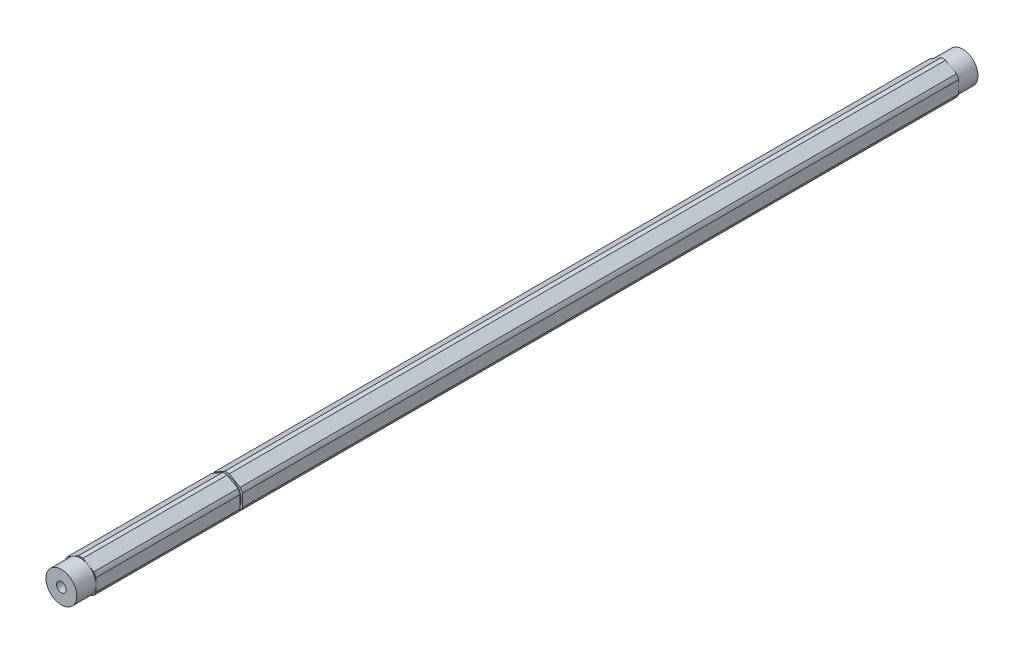
ISO-10303-21;
HEADER;
FILE_DESCRIPTION(('STEP AP214'),'2;1');
FILE_NAME('part.step','',(''),(''),'','','');
FILE_SCHEMA(('AUTOMOTIVE_DESIGN { 1 0 10303 214 1 1 1 1 }'));
ENDSEC;
DATA;
#1=APPLICATION_CONTEXT('core data for automotive mechanical design processes');
#2=APPLICATION_PROTOCOL_DEFINITION('international standard','automotive_design',2000,#1);
#3=PRODUCT_CONTEXT('',#1,'mechanical');
#4=PRODUCT('Part','Part','',(#3));
#5=PRODUCT_RELATED_PRODUCT_CATEGORY('part','',(#4));
#6=PRODUCT_DEFINITION_FORMATION('','',#4);
#7=PRODUCT_DEFINITION_CONTEXT('part definition',#1,'design');
#8=PRODUCT_DEFINITION('design','',#6,#7);
#9=PRODUCT_DEFINITION_SHAPE('','',#8);
#10=(LENGTH_UNIT() NAMED_UNIT(*) SI_UNIT(.MILLI.,.METRE.));
#11=(NAMED_UNIT(*) PLANE_ANGLE_UNIT() SI_UNIT($,.RADIAN.));
#12=(NAMED_UNIT(*) SI_UNIT($,.STERADIAN.) SOLID_ANGLE_UNIT());
#13=UNCERTAINTY_MEASURE_WITH_UNIT(LENGTH_MEASURE(1.E-05),#10,'distance_accuracy_value','');
#14=(GEOMETRIC_REPRESENTATION_CONTEXT(3) GLOBAL_UNCERTAINTY_ASSIGNED_CONTEXT((#13)) GLOBAL_UNIT_ASSIGNED_CONTEXT((#10,
#11,#12)) REPRESENTATION_CONTEXT('',''));
#15=CARTESIAN_POINT('',(0.,0.,0.));
#16=DIRECTION('',(0.,0.,1.));
#17=DIRECTION('',(1.,0.,0.));
#18=AXIS2_PLACEMENT_3D('',#15,#16,#17);
#19=CARTESIAN_POINT('',(6.35,0.,177.8));
#20=DIRECTION('',(-1.,0.,0.));
#21=DIRECTION('',(0.,0.,1.));
#22=AXIS2_PLACEMENT_3D('',#19,#20,#21);
#23=PLANE('',#22);
#24=DIRECTION('',(0.,-1.,0.));
#25=VECTOR('',#24,1.);
#26=CARTESIAN_POINT('',(6.35,0.,118.364));
#27=LINE('',#26,#25);
#28=CARTESIAN_POINT('',(6.35,2.59030191290514,118.364));
#29=VERTEX_POINT('',#28);
#30=CARTESIAN_POINT('',(6.35,-2.59030191290514,118.364));
#31=VERTEX_POINT('',#30);
#32=EDGE_CURVE('E60',#29,#31,#27,.T.);
#33=ORIENTED_EDGE('',*,*,#32,.F.);
#34=DIRECTION('',(0.,0.,-1.));
#35=VECTOR('',#34,1.);
#36=CARTESIAN_POINT('',(6.35,2.59030191290514,177.8));
#37=LINE('',#36,#35);
#38=CARTESIAN_POINT('',(6.35,2.59030191290514,177.8));
#39=VERTEX_POINT('',#38);
#40=EDGE_CURVE('E259',#39,#29,#37,.T.);
#41=ORIENTED_EDGE('',*,*,#40,.F.);
#42=DIRECTION('',(0.,1.,0.));
#43=VECTOR('',#42,1.);
#44=CARTESIAN_POINT('',(6.35,0.,177.8));
#45=LINE('',#44,#43);
#46=CARTESIAN_POINT('',(6.35,0.,177.8));
#47=VERTEX_POINT('',#46);
#48=EDGE_CURVE('E454',#47,#39,#45,.T.);
#49=ORIENTED_EDGE('',*,*,#48,.F.);
#50=CARTESIAN_POINT('',(6.35,-2.59030191290514,177.8));
#51=VERTEX_POINT('',#50);
#52=EDGE_CURVE('E457',#51,#47,#45,.T.);
#53=ORIENTED_EDGE('',*,*,#52,.F.);
#54=DIRECTION('',(0.,0.,-1.));
#55=VECTOR('',#54,1.);
#56=CARTESIAN_POINT('',(6.35,-2.59030191290514,177.8));
#57=LINE('',#56,#55);
#58=EDGE_CURVE('E384',#51,#31,#57,.T.);
#59=ORIENTED_EDGE('',*,*,#58,.T.);
#60=EDGE_LOOP('',(#33,#41,#49,#53,#59));
#61=FACE_BOUND('',#60,.T.);
#62=ADVANCED_FACE('F38',(#61),#23,.F.);
#63=DIRECTION('',(0.,1.,0.));
#64=VECTOR('',#63,1.);
#65=CARTESIAN_POINT('',(6.35,0.,117.475));
#66=LINE('',#65,#64);
#67=CARTESIAN_POINT('',(6.35,-2.59030191290514,117.475));
#68=VERTEX_POINT('',#67);
#69=CARTESIAN_POINT('',(6.35,2.59030191290514,117.475));
#70=VERTEX_POINT('',#69);
#71=EDGE_CURVE('E232',#68,#70,#66,.T.);
#72=ORIENTED_EDGE('',*,*,#71,.F.);
#73=CARTESIAN_POINT('',(6.35,-2.59030191290514,-177.8));
#74=VERTEX_POINT('',#73);
#75=EDGE_CURVE('E388',#68,#74,#57,.T.);
#76=ORIENTED_EDGE('',*,*,#75,.T.);
#77=DIRECTION('',(0.,1.,0.));
#78=VECTOR('',#77,1.);
#79=CARTESIAN_POINT('',(6.35,0.,-177.8));
#80=LINE('',#79,#78);
#81=CARTESIAN_POINT('',(6.35,0.,-177.8));
#82=VERTEX_POINT('',#81);
#83=EDGE_CURVE('E355',#74,#82,#80,.T.);
#84=ORIENTED_EDGE('',*,*,#83,.T.);
#85=CARTESIAN_POINT('',(6.35,2.59030191290514,-177.8));
#86=VERTEX_POINT('',#85);
#87=EDGE_CURVE('E257',#82,#86,#80,.T.);
#88=ORIENTED_EDGE('',*,*,#87,.T.);
#89=EDGE_CURVE('E247',#70,#86,#37,.T.);
#90=ORIENTED_EDGE('',*,*,#89,.F.);
#91=EDGE_LOOP('',(#72,#76,#84,#88,#90));
#92=FACE_BOUND('',#91,.T.);
#93=ADVANCED_FACE('F254',(#92),#23,.F.);
#94=CARTESIAN_POINT('',(0.,0.,177.8));
#95=DIRECTION('',(0.,0.,-1.));
#96=DIRECTION('',(-1.,0.,0.));
#97=AXIS2_PLACEMENT_3D('',#94,#95,#96);
#98=CYLINDRICAL_SURFACE('',#97,6.858);
#99=CARTESIAN_POINT('',(0.,0.,118.364));
#100=DIRECTION('',(0.,0.,1.));
#101=DIRECTION('',(1.,0.,0.));
#102=AXIS2_PLACEMENT_3D('',#99,#100,#101);
#103=CIRCLE('',#102,6.858);
#104=CARTESIAN_POINT('',(5.41826726004727,4.20411035757862,118.364));
#105=VERTEX_POINT('',#104);
#106=EDGE_CURVE('E585',#29,#105,#103,.T.);
#107=ORIENTED_EDGE('',*,*,#106,.T.);
#108=DIRECTION('',(0.,0.,-1.));
#109=VECTOR('',#108,1.);
#110=CARTESIAN_POINT('',(5.41826726004728,4.20411035757862,177.8));
#111=LINE('',#110,#109);
#112=CARTESIAN_POINT('',(5.41826726004728,4.20411035757862,177.8));
#113=VERTEX_POINT('',#112);
#114=EDGE_CURVE('E260',#113,#105,#111,.T.);
#115=ORIENTED_EDGE('',*,*,#114,.F.);
#116=CARTESIAN_POINT('',(0.,0.,177.8));
#117=DIRECTION('',(0.,0.,1.));
#118=DIRECTION('',(1.,0.,0.));
#119=AXIS2_PLACEMENT_3D('',#116,#117,#118);
#120=CIRCLE('',#119,6.858);
#121=EDGE_CURVE('E461',#39,#113,#120,.T.);
#122=ORIENTED_EDGE('',*,*,#121,.F.);
#123=ORIENTED_EDGE('',*,*,#40,.T.);
#124=EDGE_LOOP('',(#107,#115,#122,#123));
#125=FACE_BOUND('',#124,.T.);
#126=ADVANCED_FACE('F544',(#125),#98,.T.);
#127=CARTESIAN_POINT('',(0.,0.,117.475));
#128=DIRECTION('',(0.,0.,1.));
#129=DIRECTION('',(1.,0.,0.));
#130=AXIS2_PLACEMENT_3D('',#127,#128,#129);
#131=CIRCLE('',#130,6.858);
#132=CARTESIAN_POINT('',(5.41826726004727,4.20411035757862,117.475));
#133=VERTEX_POINT('',#132);
#134=EDGE_CURVE('E235',#70,#133,#131,.T.);
#135=ORIENTED_EDGE('',*,*,#134,.F.);
#136=ORIENTED_EDGE('',*,*,#89,.T.);
#137=CARTESIAN_POINT('',(0.,0.,-177.8));
#138=DIRECTION('',(0.,0.,1.));
#139=DIRECTION('',(1.,0.,0.));
#140=AXIS2_PLACEMENT_3D('',#137,#138,#139);
#141=CIRCLE('',#140,6.858);
#142=CARTESIAN_POINT('',(5.41826726004728,4.20411035757862,-177.8));
#143=VERTEX_POINT('',#142);
#144=EDGE_CURVE('E357',#86,#143,#141,.T.);
#145=ORIENTED_EDGE('',*,*,#144,.T.);
#146=EDGE_CURVE('E249',#133,#143,#111,.T.);
#147=ORIENTED_EDGE('',*,*,#146,.F.);
#148=EDGE_LOOP('',(#135,#136,#145,#147));
#149=FACE_BOUND('',#148,.T.);
#150=ADVANCED_FACE('F245',(#149),#98,.T.);
#151=CARTESIAN_POINT('',(3.175,5.49926131403118,177.8));
#152=DIRECTION('',(-0.5,-0.866025403784439,0.));
#153=DIRECTION('',(0.866025403784439,-0.5,0.));
#154=AXIS2_PLACEMENT_3D('',#151,#152,#153);
#155=PLANE('',#154);
#156=DIRECTION('',(0.866025403784439,-0.5,0.));
#157=VECTOR('',#156,1.);
#158=CARTESIAN_POINT('',(3.175,5.49926131403118,118.364));
#159=LINE('',#158,#157);
#160=CARTESIAN_POINT('',(0.931732739952726,6.79441227048375,118.364));
#161=VERTEX_POINT('',#160);
#162=EDGE_CURVE('E476',#161,#105,#159,.T.);
#163=ORIENTED_EDGE('',*,*,#162,.F.);
#164=DIRECTION('',(0.,0.,-1.));
#165=VECTOR('',#164,1.);
#166=CARTESIAN_POINT('',(0.931732739952726,6.79441227048375,177.8));
#167=LINE('',#166,#165);
#168=CARTESIAN_POINT('',(0.931732739952726,6.79441227048375,177.8));
#169=VERTEX_POINT('',#168);
#170=EDGE_CURVE('E417',#169,#161,#167,.T.);
#171=ORIENTED_EDGE('',*,*,#170,.F.);
#172=DIRECTION('',(-0.866025403784439,0.5,0.));
#173=VECTOR('',#172,1.);
#174=CARTESIAN_POINT('',(3.175,5.49926131403118,177.8));
#175=LINE('',#174,#173);
#176=CARTESIAN_POINT('',(3.175,5.49926131403118,177.8));
#177=VERTEX_POINT('',#176);
#178=EDGE_CURVE('E462',#177,#169,#175,.T.);
#179=ORIENTED_EDGE('',*,*,#178,.F.);
#180=EDGE_CURVE('E464',#113,#177,#175,.T.);
#181=ORIENTED_EDGE('',*,*,#180,.F.);
#182=ORIENTED_EDGE('',*,*,#114,.T.);
#183=EDGE_LOOP('',(#163,#171,#179,#181,#182));
#184=FACE_BOUND('',#183,.T.);
#185=ADVANCED_FACE('F475',(#184),#155,.F.);
#186=DIRECTION('',(-0.866025403784439,0.5,0.));
#187=VECTOR('',#186,1.);
#188=CARTESIAN_POINT('',(3.175,5.49926131403118,117.475));
#189=LINE('',#188,#187);
#190=CARTESIAN_POINT('',(0.931732739952726,6.79441227048375,117.475));
#191=VERTEX_POINT('',#190);
#192=EDGE_CURVE('E241',#133,#191,#189,.T.);
#193=ORIENTED_EDGE('',*,*,#192,.F.);
#194=ORIENTED_EDGE('',*,*,#146,.T.);
#195=DIRECTION('',(-0.866025403784439,0.5,0.));
#196=VECTOR('',#195,1.);
#197=CARTESIAN_POINT('',(3.175,5.49926131403118,-177.8));
#198=LINE('',#197,#196);
#199=CARTESIAN_POINT('',(3.175,5.49926131403118,-177.8));
#200=VERTEX_POINT('',#199);
#201=EDGE_CURVE('E362',#143,#200,#198,.T.);
#202=ORIENTED_EDGE('',*,*,#201,.T.);
#203=CARTESIAN_POINT('',(0.931732739952726,6.79441227048375,-177.8));
#204=VERTEX_POINT('',#203);
#205=EDGE_CURVE('E359',#200,#204,#198,.T.);
#206=ORIENTED_EDGE('',*,*,#205,.T.);
#207=EDGE_CURVE('E416',#191,#204,#167,.T.);
#208=ORIENTED_EDGE('',*,*,#207,.F.);
#209=EDGE_LOOP('',(#193,#194,#202,#206,#208));
#210=FACE_BOUND('',#209,.T.);
#211=ADVANCED_FACE('F432',(#210),#155,.F.);
#212=CARTESIAN_POINT('',(-0.931732739952718,6.79441227048375,118.364));
#213=VERTEX_POINT('',#212);
#214=EDGE_CURVE('E479',#161,#213,#103,.T.);
#215=ORIENTED_EDGE('',*,*,#214,.T.);
#216=DIRECTION('',(0.,0.,-1.));
#217=VECTOR('',#216,1.);
#218=CARTESIAN_POINT('',(-0.931732739952727,6.79441227048375,177.8));
#219=LINE('',#218,#217);
#220=CARTESIAN_POINT('',(-0.931732739952727,6.79441227048375,177.8));
#221=VERTEX_POINT('',#220);
#222=EDGE_CURVE('E414',#221,#213,#219,.T.);
#223=ORIENTED_EDGE('',*,*,#222,.F.);
#224=EDGE_CURVE('E463',#169,#221,#120,.T.);
#225=ORIENTED_EDGE('',*,*,#224,.F.);
#226=ORIENTED_EDGE('',*,*,#170,.T.);
#227=EDGE_LOOP('',(#215,#223,#225,#226));
#228=FACE_BOUND('',#227,.T.);
#229=ADVANCED_FACE('F477',(#228),#98,.T.);
#230=CARTESIAN_POINT('',(-0.931732739952718,6.79441227048375,117.475));
#231=VERTEX_POINT('',#230);
#232=EDGE_CURVE('E251',#191,#231,#131,.T.);
#233=ORIENTED_EDGE('',*,*,#232,.F.);
#234=ORIENTED_EDGE('',*,*,#207,.T.);
#235=CARTESIAN_POINT('',(-0.931732739952727,6.79441227048375,-177.8));
#236=VERTEX_POINT('',#235);
#237=EDGE_CURVE('E361',#204,#236,#141,.T.);
#238=ORIENTED_EDGE('',*,*,#237,.T.);
#239=EDGE_CURVE('E413',#231,#236,#219,.T.);
#240=ORIENTED_EDGE('',*,*,#239,.F.);
#241=EDGE_LOOP('',(#233,#234,#238,#240));
#242=FACE_BOUND('',#241,.T.);
#243=ADVANCED_FACE('F428',(#242),#98,.T.);
#244=CARTESIAN_POINT('',(-3.175,5.49926131403118,177.8));
#245=DIRECTION('',(0.5,-0.866025403784438,0.));
#246=DIRECTION('',(0.866025403784439,0.5,0.));
#247=AXIS2_PLACEMENT_3D('',#244,#245,#246);
#248=PLANE('',#247);
#249=DIRECTION('',(0.866025403784439,0.5,0.));
#250=VECTOR('',#249,1.);
#251=CARTESIAN_POINT('',(-3.175,5.49926131403118,118.364));
#252=LINE('',#251,#250);
#253=CARTESIAN_POINT('',(-5.41826726004727,4.20411035757862,118.364));
#254=VERTEX_POINT('',#253);
#255=EDGE_CURVE('E484',#254,#213,#252,.T.);
#256=ORIENTED_EDGE('',*,*,#255,.F.);
#257=DIRECTION('',(0.,0.,-1.));
#258=VECTOR('',#257,1.);
#259=CARTESIAN_POINT('',(-5.41826726004728,4.20411035757862,177.8));
#260=LINE('',#259,#258);
#261=CARTESIAN_POINT('',(-5.41826726004728,4.20411035757862,177.8));
#262=VERTEX_POINT('',#261);
#263=EDGE_CURVE('E410',#262,#254,#260,.T.);
#264=ORIENTED_EDGE('',*,*,#263,.F.);
#265=DIRECTION('',(-0.866025403784439,-0.5,0.));
#266=VECTOR('',#265,1.);
#267=CARTESIAN_POINT('',(-3.175,5.49926131403118,177.8));
#268=LINE('',#267,#266);
#269=CARTESIAN_POINT('',(-3.175,5.49926131403119,177.8));
#270=VERTEX_POINT('',#269);
#271=EDGE_CURVE('E467',#270,#262,#268,.T.);
#272=ORIENTED_EDGE('',*,*,#271,.F.);
#273=EDGE_CURVE('E347',#221,#270,#268,.T.);
#274=ORIENTED_EDGE('',*,*,#273,.F.);
#275=ORIENTED_EDGE('',*,*,#222,.T.);
#276=EDGE_LOOP('',(#256,#264,#272,#274,#275));
#277=FACE_BOUND('',#276,.T.);
#278=ADVANCED_FACE('F482',(#277),#248,.F.);
#279=DIRECTION('',(-0.866025403784439,-0.5,0.));
#280=VECTOR('',#279,1.);
#281=CARTESIAN_POINT('',(-3.175,5.49926131403118,117.475));
#282=LINE('',#281,#280);
#283=CARTESIAN_POINT('',(-5.41826726004727,4.20411035757862,117.475));
#284=VERTEX_POINT('',#283);
#285=EDGE_CURVE('E603',#231,#284,#282,.T.);
#286=ORIENTED_EDGE('',*,*,#285,.F.);
#287=ORIENTED_EDGE('',*,*,#239,.T.);
#288=DIRECTION('',(-0.866025403784439,-0.5,0.));
#289=VECTOR('',#288,1.);
#290=CARTESIAN_POINT('',(-3.175,5.49926131403118,-177.8));
#291=LINE('',#290,#289);
#292=CARTESIAN_POINT('',(-3.175,5.49926131403118,-177.8));
#293=VERTEX_POINT('',#292);
#294=EDGE_CURVE('E365',#236,#293,#291,.T.);
#295=ORIENTED_EDGE('',*,*,#294,.T.);
#296=CARTESIAN_POINT('',(-5.41826726004728,4.20411035757862,-177.8));
#297=VERTEX_POINT('',#296);
#298=EDGE_CURVE('E369',#293,#297,#291,.T.);
#299=ORIENTED_EDGE('',*,*,#298,.T.);
#300=EDGE_CURVE('E409',#284,#297,#260,.T.);
#301=ORIENTED_EDGE('',*,*,#300,.F.);
#302=EDGE_LOOP('',(#286,#287,#295,#299,#301));
#303=FACE_BOUND('',#302,.T.);
#304=ADVANCED_FACE('F550',(#303),#248,.F.);
#305=CARTESIAN_POINT('',(-6.35,2.59030191290514,118.364));
#306=VERTEX_POINT('',#305);
#307=EDGE_CURVE('E488',#254,#306,#103,.T.);
#308=ORIENTED_EDGE('',*,*,#307,.T.);
#309=DIRECTION('',(0.,0.,-1.));
#310=VECTOR('',#309,1.);
#311=CARTESIAN_POINT('',(-6.35,2.59030191290514,177.8));
#312=LINE('',#311,#310);
#313=CARTESIAN_POINT('',(-6.35,2.59030191290514,177.8));
#314=VERTEX_POINT('',#313);
#315=EDGE_CURVE('E407',#314,#306,#312,.T.);
#316=ORIENTED_EDGE('',*,*,#315,.F.);
#317=EDGE_CURVE('E334',#262,#314,#120,.T.);
#318=ORIENTED_EDGE('',*,*,#317,.F.);
#319=ORIENTED_EDGE('',*,*,#263,.T.);
#320=EDGE_LOOP('',(#308,#316,#318,#319));
#321=FACE_BOUND('',#320,.T.);
#322=ADVANCED_FACE('F487',(#321),#98,.T.);
#323=CARTESIAN_POINT('',(-6.35,2.59030191290514,117.475));
#324=VERTEX_POINT('',#323);
#325=EDGE_CURVE('E656',#284,#324,#131,.T.);
#326=ORIENTED_EDGE('',*,*,#325,.F.);
#327=ORIENTED_EDGE('',*,*,#300,.T.);
#328=CARTESIAN_POINT('',(-6.35,2.59030191290514,-177.8));
#329=VERTEX_POINT('',#328);
#330=EDGE_CURVE('E368',#297,#329,#141,.T.);
#331=ORIENTED_EDGE('',*,*,#330,.T.);
#332=EDGE_CURVE('E406',#324,#329,#312,.T.);
#333=ORIENTED_EDGE('',*,*,#332,.F.);
#334=EDGE_LOOP('',(#326,#327,#331,#333));
#335=FACE_BOUND('',#334,.T.);
#336=ADVANCED_FACE('F554',(#335),#98,.T.);
#337=CARTESIAN_POINT('',(-6.35,0.,177.8));
#338=DIRECTION('',(1.,0.,0.));
#339=DIRECTION('',(0.,1.,0.));
#340=AXIS2_PLACEMENT_3D('',#337,#338,#339);
#341=PLANE('',#340);
#342=DIRECTION('',(0.,1.,0.));
#343=VECTOR('',#342,1.);
#344=CARTESIAN_POINT('',(-6.35,0.,118.364));
#345=LINE('',#344,#343);
#346=CARTESIAN_POINT('',(-6.35,-2.59030191290514,118.364));
#347=VERTEX_POINT('',#346);
#348=EDGE_CURVE('E489',#347,#306,#345,.T.);
#349=ORIENTED_EDGE('',*,*,#348,.F.);
#350=DIRECTION('',(0.,0.,-1.));
#351=VECTOR('',#350,1.);
#352=CARTESIAN_POINT('',(-6.35,-2.59030191290514,177.8));
#353=LINE('',#352,#351);
#354=CARTESIAN_POINT('',(-6.35,-2.59030191290514,177.8));
#355=VERTEX_POINT('',#354);
#356=EDGE_CURVE('E332',#355,#347,#353,.T.);
#357=ORIENTED_EDGE('',*,*,#356,.F.);
#358=DIRECTION('',(0.,-1.,0.));
#359=VECTOR('',#358,1.);
#360=CARTESIAN_POINT('',(-6.35,0.,177.8));
#361=LINE('',#360,#359);
#362=CARTESIAN_POINT('',(-6.35,0.,177.8));
#363=VERTEX_POINT('',#362);
#364=EDGE_CURVE('E320',#363,#355,#361,.T.);
#365=ORIENTED_EDGE('',*,*,#364,.F.);
#366=EDGE_CURVE('E330',#314,#363,#361,.T.);
#367=ORIENTED_EDGE('',*,*,#366,.F.);
#368=ORIENTED_EDGE('',*,*,#315,.T.);
#369=EDGE_LOOP('',(#349,#357,#365,#367,#368));
#370=FACE_BOUND('',#369,.T.);
#371=ADVANCED_FACE('F328',(#370),#341,.F.);
#372=DIRECTION('',(0.,-1.,0.));
#373=VECTOR('',#372,1.);
#374=CARTESIAN_POINT('',(-6.35,0.,117.475));
#375=LINE('',#374,#373);
#376=CARTESIAN_POINT('',(-6.35,-2.59030191290514,117.475));
#377=VERTEX_POINT('',#376);
#378=EDGE_CURVE('E605',#324,#377,#375,.T.);
#379=ORIENTED_EDGE('',*,*,#378,.F.);
#380=ORIENTED_EDGE('',*,*,#332,.T.);
#381=DIRECTION('',(0.,-1.,0.));
#382=VECTOR('',#381,1.);
#383=CARTESIAN_POINT('',(-6.35,0.,-177.8));
#384=LINE('',#383,#382);
#385=CARTESIAN_POINT('',(-6.35,0.,-177.8));
#386=VERTEX_POINT('',#385);
#387=EDGE_CURVE('E370',#329,#386,#384,.T.);
#388=ORIENTED_EDGE('',*,*,#387,.T.);
#389=CARTESIAN_POINT('',(-6.35,-2.59030191290514,-177.8));
#390=VERTEX_POINT('',#389);
#391=EDGE_CURVE('E374',#386,#390,#384,.T.);
#392=ORIENTED_EDGE('',*,*,#391,.T.);
#393=EDGE_CURVE('E404',#377,#390,#353,.T.);
#394=ORIENTED_EDGE('',*,*,#393,.F.);
#395=EDGE_LOOP('',(#379,#380,#388,#392,#394));
#396=FACE_BOUND('',#395,.T.);
#397=ADVANCED_FACE('F553',(#396),#341,.F.);
#398=CARTESIAN_POINT('',(-5.41826726004728,-4.2041103575786,118.364));
#399=VERTEX_POINT('',#398);
#400=EDGE_CURVE('E496',#347,#399,#103,.T.);
#401=ORIENTED_EDGE('',*,*,#400,.T.);
#402=DIRECTION('',(0.,0.,-1.));
#403=VECTOR('',#402,1.);
#404=CARTESIAN_POINT('',(-5.41826726004728,-4.20411035757861,177.8));
#405=LINE('',#404,#403);
#406=CARTESIAN_POINT('',(-5.41826726004728,-4.20411035757861,177.8));
#407=VERTEX_POINT('',#406);
#408=EDGE_CURVE('E401',#407,#399,#405,.T.);
#409=ORIENTED_EDGE('',*,*,#408,.F.);
#410=EDGE_CURVE('E341',#355,#407,#120,.T.);
#411=ORIENTED_EDGE('',*,*,#410,.F.);
#412=ORIENTED_EDGE('',*,*,#356,.T.);
#413=EDGE_LOOP('',(#401,#409,#411,#412));
#414=FACE_BOUND('',#413,.T.);
#415=ADVANCED_FACE('F494',(#414),#98,.T.);
#416=CARTESIAN_POINT('',(-5.41826726004728,-4.2041103575786,117.475));
#417=VERTEX_POINT('',#416);
#418=EDGE_CURVE('E584',#377,#417,#131,.T.);
#419=ORIENTED_EDGE('',*,*,#418,.F.);
#420=ORIENTED_EDGE('',*,*,#393,.T.);
#421=CARTESIAN_POINT('',(-5.41826726004728,-4.20411035757861,-177.8));
#422=VERTEX_POINT('',#421);
#423=EDGE_CURVE('E373',#390,#422,#141,.T.);
#424=ORIENTED_EDGE('',*,*,#423,.T.);
#425=EDGE_CURVE('E400',#417,#422,#405,.T.);
#426=ORIENTED_EDGE('',*,*,#425,.F.);
#427=EDGE_LOOP('',(#419,#420,#424,#426));
#428=FACE_BOUND('',#427,.T.);
#429=ADVANCED_FACE('F558',(#428),#98,.T.);
#430=CARTESIAN_POINT('',(-3.175,-5.49926131403118,177.8));
#431=DIRECTION('',(0.5,0.866025403784438,0.));
#432=DIRECTION('',(-0.866025403784439,0.5,0.));
#433=AXIS2_PLACEMENT_3D('',#430,#431,#432);
#434=PLANE('',#433);
#435=DIRECTION('',(-0.866025403784439,0.5,0.));
#436=VECTOR('',#435,1.);
#437=CARTESIAN_POINT('',(-3.175,-5.49926131403118,118.364));
#438=LINE('',#437,#436);
#439=CARTESIAN_POINT('',(-0.931732739952719,-6.79441227048375,118.364));
#440=VERTEX_POINT('',#439);
#441=EDGE_CURVE('E490',#440,#399,#438,.T.);
#442=ORIENTED_EDGE('',*,*,#441,.F.);
#443=DIRECTION('',(0.,0.,-1.));
#444=VECTOR('',#443,1.);
#445=CARTESIAN_POINT('',(-0.931732739952719,-6.79441227048376,177.8));
#446=LINE('',#445,#444);
#447=CARTESIAN_POINT('',(-0.931732739952719,-6.79441227048376,177.8));
#448=VERTEX_POINT('',#447);
#449=EDGE_CURVE('E397',#448,#440,#446,.T.);
#450=ORIENTED_EDGE('',*,*,#449,.F.);
#451=DIRECTION('',(0.866025403784439,-0.5,0.));
#452=VECTOR('',#451,1.);
#453=CARTESIAN_POINT('',(-3.175,-5.49926131403118,177.8));
#454=LINE('',#453,#452);
#455=CARTESIAN_POINT('',(-3.175,-5.49926131403118,177.8));
#456=VERTEX_POINT('',#455);
#457=EDGE_CURVE('E342',#456,#448,#454,.T.);
#458=ORIENTED_EDGE('',*,*,#457,.F.);
#459=EDGE_CURVE('E323',#407,#456,#454,.T.);
#460=ORIENTED_EDGE('',*,*,#459,.F.);
#461=ORIENTED_EDGE('',*,*,#408,.T.);
#462=EDGE_LOOP('',(#442,#450,#458,#460,#461));
#463=FACE_BOUND('',#462,.T.);
#464=ADVANCED_FACE('F500',(#463),#434,.F.);
#465=DIRECTION('',(0.866025403784439,-0.5,0.));
#466=VECTOR('',#465,1.);
#467=CARTESIAN_POINT('',(-3.175,-5.49926131403118,117.475));
#468=LINE('',#467,#466);
#469=CARTESIAN_POINT('',(-0.931732739952719,-6.79441227048375,117.475));
#470=VERTEX_POINT('',#469);
#471=EDGE_CURVE('E588',#417,#470,#468,.T.);
#472=ORIENTED_EDGE('',*,*,#471,.F.);
#473=ORIENTED_EDGE('',*,*,#425,.T.);
#474=DIRECTION('',(0.866025403784439,-0.5,0.));
#475=VECTOR('',#474,1.);
#476=CARTESIAN_POINT('',(-3.175,-5.49926131403118,-177.8));
#477=LINE('',#476,#475);
#478=CARTESIAN_POINT('',(-3.175,-5.49926131403118,-177.8));
#479=VERTEX_POINT('',#478);
#480=EDGE_CURVE('E375',#422,#479,#477,.T.);
#481=ORIENTED_EDGE('',*,*,#480,.T.);
#482=CARTESIAN_POINT('',(-0.931732739952719,-6.79441227048376,-177.8));
#483=VERTEX_POINT('',#482);
#484=EDGE_CURVE('E379',#479,#483,#477,.T.);
#485=ORIENTED_EDGE('',*,*,#484,.T.);
#486=EDGE_CURVE('E396',#470,#483,#446,.T.);
#487=ORIENTED_EDGE('',*,*,#486,.F.);
#488=EDGE_LOOP('',(#472,#473,#481,#485,#487));
#489=FACE_BOUND('',#488,.T.);
#490=ADVANCED_FACE('F557',(#489),#434,.F.);
#491=CARTESIAN_POINT('',(0.93173273995272,-6.79441227048375,118.364));
#492=VERTEX_POINT('',#491);
#493=EDGE_CURVE('E619',#440,#492,#103,.T.);
#494=ORIENTED_EDGE('',*,*,#493,.T.);
#495=DIRECTION('',(0.,0.,-1.));
#496=VECTOR('',#495,1.);
#497=CARTESIAN_POINT('',(0.931732739952734,-6.79441227048375,177.8));
#498=LINE('',#497,#496);
#499=CARTESIAN_POINT('',(0.931732739952734,-6.79441227048375,177.8));
#500=VERTEX_POINT('',#499);
#501=EDGE_CURVE('E393',#500,#492,#498,.T.);
#502=ORIENTED_EDGE('',*,*,#501,.F.);
#503=EDGE_CURVE('E344',#448,#500,#120,.T.);
#504=ORIENTED_EDGE('',*,*,#503,.F.);
#505=ORIENTED_EDGE('',*,*,#449,.T.);
#506=EDGE_LOOP('',(#494,#502,#504,#505));
#507=FACE_BOUND('',#506,.T.);
#508=ADVANCED_FACE('F577',(#507),#98,.T.);
#509=CARTESIAN_POINT('',(0.93173273995272,-6.79441227048375,117.475));
#510=VERTEX_POINT('',#509);
#511=EDGE_CURVE('E253',#470,#510,#131,.T.);
#512=ORIENTED_EDGE('',*,*,#511,.F.);
#513=ORIENTED_EDGE('',*,*,#486,.T.);
#514=CARTESIAN_POINT('',(0.931732739952734,-6.79441227048375,-177.8));
#515=VERTEX_POINT('',#514);
#516=EDGE_CURVE('E378',#483,#515,#141,.T.);
#517=ORIENTED_EDGE('',*,*,#516,.T.);
#518=EDGE_CURVE('E392',#510,#515,#498,.T.);
#519=ORIENTED_EDGE('',*,*,#518,.F.);
#520=EDGE_LOOP('',(#512,#513,#517,#519));
#521=FACE_BOUND('',#520,.T.);
#522=ADVANCED_FACE('F560',(#521),#98,.T.);
#523=CARTESIAN_POINT('',(3.175,-5.49926131403119,177.8));
#524=DIRECTION('',(-0.5,0.866025403784438,0.));
#525=DIRECTION('',(-0.866025403784439,-0.5,0.));
#526=AXIS2_PLACEMENT_3D('',#523,#524,#525);
#527=PLANE('',#526);
#528=DIRECTION('',(-0.866025403784439,-0.5,0.));
#529=VECTOR('',#528,1.);
#530=CARTESIAN_POINT('',(3.175,-5.49926131403119,118.364));
#531=LINE('',#530,#529);
#532=CARTESIAN_POINT('',(5.41826726004727,-4.20411035757862,118.364));
#533=VERTEX_POINT('',#532);
#534=EDGE_CURVE('E240',#533,#492,#531,.T.);
#535=ORIENTED_EDGE('',*,*,#534,.F.);
#536=DIRECTION('',(0.,0.,-1.));
#537=VECTOR('',#536,1.);
#538=CARTESIAN_POINT('',(5.41826726004727,-4.20411035757862,177.8));
#539=LINE('',#538,#537);
#540=CARTESIAN_POINT('',(5.41826726004727,-4.20411035757862,177.8));
#541=VERTEX_POINT('',#540);
#542=EDGE_CURVE('E389',#541,#533,#539,.T.);
#543=ORIENTED_EDGE('',*,*,#542,.F.);
#544=DIRECTION('',(0.866025403784439,0.5,0.));
#545=VECTOR('',#544,1.);
#546=CARTESIAN_POINT('',(3.175,-5.49926131403119,177.8));
#547=LINE('',#546,#545);
#548=CARTESIAN_POINT('',(3.175,-5.49926131403119,177.8));
#549=VERTEX_POINT('',#548);
#550=EDGE_CURVE('E354',#549,#541,#547,.T.);
#551=ORIENTED_EDGE('',*,*,#550,.F.);
#552=EDGE_CURVE('E350',#500,#549,#547,.T.);
#553=ORIENTED_EDGE('',*,*,#552,.F.);
#554=ORIENTED_EDGE('',*,*,#501,.T.);
#555=EDGE_LOOP('',(#535,#543,#551,#553,#554));
#556=FACE_BOUND('',#555,.T.);
#557=ADVANCED_FACE('F510',(#556),#527,.F.);
#558=DIRECTION('',(0.866025403784439,0.5,0.));
#559=VECTOR('',#558,1.);
#560=CARTESIAN_POINT('',(3.175,-5.49926131403119,117.475));
#561=LINE('',#560,#559);
#562=CARTESIAN_POINT('',(5.41826726004727,-4.20411035757862,117.475));
#563=VERTEX_POINT('',#562);
#564=EDGE_CURVE('E53',#510,#563,#561,.T.);
#565=ORIENTED_EDGE('',*,*,#564,.F.);
#566=ORIENTED_EDGE('',*,*,#518,.T.);
#567=DIRECTION('',(0.866025403784439,0.5,0.));
#568=VECTOR('',#567,1.);
#569=CARTESIAN_POINT('',(3.175,-5.49926131403119,-177.8));
#570=LINE('',#569,#568);
#571=CARTESIAN_POINT('',(3.175,-5.49926131403118,-177.8));
#572=VERTEX_POINT('',#571);
#573=EDGE_CURVE('E380',#515,#572,#570,.T.);
#574=ORIENTED_EDGE('',*,*,#573,.T.);
#575=CARTESIAN_POINT('',(5.41826726004727,-4.20411035757862,-177.8));
#576=VERTEX_POINT('',#575);
#577=EDGE_CURVE('E383',#572,#576,#570,.T.);
#578=ORIENTED_EDGE('',*,*,#577,.T.);
#579=EDGE_CURVE('E387',#563,#576,#539,.T.);
#580=ORIENTED_EDGE('',*,*,#579,.F.);
#581=EDGE_LOOP('',(#565,#566,#574,#578,#580));
#582=FACE_BOUND('',#581,.T.);
#583=ADVANCED_FACE('F518',(#582),#527,.F.);
#584=CARTESIAN_POINT('',(0.,0.,118.364));
#585=DIRECTION('',(0.,0.,-1.));
#586=DIRECTION('',(-1.,0.,0.));
#587=AXIS2_PLACEMENT_3D('',#584,#585,#586);
#588=CIRCLE('',#587,6.858);
#589=EDGE_CURVE('E11',#31,#533,#588,.T.);
#590=ORIENTED_EDGE('',*,*,#589,.F.);
#591=ORIENTED_EDGE('',*,*,#58,.F.);
#592=EDGE_CURVE('E353',#541,#51,#120,.T.);
#593=ORIENTED_EDGE('',*,*,#592,.F.);
#594=ORIENTED_EDGE('',*,*,#542,.T.);
#595=EDGE_LOOP('',(#590,#591,#593,#594));
#596=FACE_BOUND('',#595,.T.);
#597=ADVANCED_FACE('F568',(#596),#98,.T.);
#598=CARTESIAN_POINT('',(0.,0.,117.475));
#599=DIRECTION('',(0.,0.,1.));
#600=DIRECTION('',(1.,0.,0.));
#601=AXIS2_PLACEMENT_3D('',#598,#599,#600);
#602=CIRCLE('',#601,6.858);
#603=EDGE_CURVE('E46',#563,#68,#602,.T.);
#604=ORIENTED_EDGE('',*,*,#603,.F.);
#605=ORIENTED_EDGE('',*,*,#579,.T.);
#606=EDGE_CURVE('E360',#576,#74,#141,.T.);
#607=ORIENTED_EDGE('',*,*,#606,.T.);
#608=ORIENTED_EDGE('',*,*,#75,.F.);
#609=EDGE_LOOP('',(#604,#605,#607,#608));
#610=FACE_BOUND('',#609,.T.);
#611=ADVANCED_FACE('F515',(#610),#98,.T.);
#612=CARTESIAN_POINT('',(0.,0.,-177.8));
#613=DIRECTION('',(0.,0.,1.));
#614=DIRECTION('',(1.,0.,0.));
#615=AXIS2_PLACEMENT_3D('',#612,#613,#614);
#616=PLANE('',#615);
#617=ORIENTED_EDGE('',*,*,#87,.F.);
#618=CARTESIAN_POINT('',(0.,0.,-177.8));
#619=DIRECTION('',(0.,0.,1.));
#620=DIRECTION('',(1.,0.,0.));
#621=AXIS2_PLACEMENT_3D('',#618,#619,#620);
#622=CIRCLE('',#621,6.35);
#623=EDGE_CURVE('E271',#82,#200,#622,.T.);
#624=ORIENTED_EDGE('',*,*,#623,.T.);
#625=ORIENTED_EDGE('',*,*,#201,.F.);
#626=ORIENTED_EDGE('',*,*,#144,.F.);
#627=EDGE_LOOP('',(#617,#624,#625,#626));
#628=FACE_BOUND('',#627,.T.);
#629=ADVANCED_FACE('F524',(#628),#616,.F.);
#630=ORIENTED_EDGE('',*,*,#205,.F.);
#631=EDGE_CURVE('E267',#200,#293,#622,.T.);
#632=ORIENTED_EDGE('',*,*,#631,.T.);
#633=ORIENTED_EDGE('',*,*,#294,.F.);
#634=ORIENTED_EDGE('',*,*,#237,.F.);
#635=EDGE_LOOP('',(#630,#632,#633,#634));
#636=FACE_BOUND('',#635,.T.);
#637=ADVANCED_FACE('F433',(#636),#616,.F.);
#638=ORIENTED_EDGE('',*,*,#298,.F.);
#639=EDGE_CURVE('E269',#293,#386,#622,.T.);
#640=ORIENTED_EDGE('',*,*,#639,.T.);
#641=ORIENTED_EDGE('',*,*,#387,.F.);
#642=ORIENTED_EDGE('',*,*,#330,.F.);
#643=EDGE_LOOP('',(#638,#640,#641,#642));
#644=FACE_BOUND('',#643,.T.);
#645=ADVANCED_FACE('F599',(#644),#616,.F.);
#646=ORIENTED_EDGE('',*,*,#391,.F.);
#647=EDGE_CURVE('E277',#386,#479,#622,.T.);
#648=ORIENTED_EDGE('',*,*,#647,.T.);
#649=ORIENTED_EDGE('',*,*,#480,.F.);
#650=ORIENTED_EDGE('',*,*,#423,.F.);
#651=EDGE_LOOP('',(#646,#648,#649,#650));
#652=FACE_BOUND('',#651,.T.);
#653=ADVANCED_FACE('F537',(#652),#616,.F.);
#654=ORIENTED_EDGE('',*,*,#484,.F.);
#655=EDGE_CURVE('E291',#479,#572,#622,.T.);
#656=ORIENTED_EDGE('',*,*,#655,.T.);
#657=ORIENTED_EDGE('',*,*,#573,.F.);
#658=ORIENTED_EDGE('',*,*,#516,.F.);
#659=EDGE_LOOP('',(#654,#656,#657,#658));
#660=FACE_BOUND('',#659,.T.);
#661=ADVANCED_FACE('F525',(#660),#616,.F.);
#662=CARTESIAN_POINT('',(0.,0.,177.8));
#663=DIRECTION('',(0.,0.,1.));
#664=DIRECTION('',(1.,0.,0.));
#665=AXIS2_PLACEMENT_3D('',#662,#663,#664);
#666=PLANE('',#665);
#667=CARTESIAN_POINT('',(0.,0.,177.8));
#668=DIRECTION('',(0.,0.,1.));
#669=DIRECTION('',(1.,0.,0.));
#670=AXIS2_PLACEMENT_3D('',#667,#668,#669);
#671=CIRCLE('',#670,6.35);
#672=EDGE_CURVE('E300',#47,#177,#671,.T.);
#673=ORIENTED_EDGE('',*,*,#672,.F.);
#674=ORIENTED_EDGE('',*,*,#48,.T.);
#675=ORIENTED_EDGE('',*,*,#121,.T.);
#676=ORIENTED_EDGE('',*,*,#180,.T.);
#677=EDGE_LOOP('',(#673,#674,#675,#676));
#678=FACE_BOUND('',#677,.T.);
#679=ADVANCED_FACE('F533',(#678),#666,.T.);
#680=EDGE_CURVE('E292',#177,#270,#671,.T.);
#681=ORIENTED_EDGE('',*,*,#680,.F.);
#682=ORIENTED_EDGE('',*,*,#178,.T.);
#683=ORIENTED_EDGE('',*,*,#224,.T.);
#684=ORIENTED_EDGE('',*,*,#273,.T.);
#685=EDGE_LOOP('',(#681,#682,#683,#684));
#686=FACE_BOUND('',#685,.T.);
#687=ADVANCED_FACE('F470',(#686),#666,.T.);
#688=EDGE_CURVE('E298',#270,#363,#671,.T.);
#689=ORIENTED_EDGE('',*,*,#688,.F.);
#690=ORIENTED_EDGE('',*,*,#271,.T.);
#691=ORIENTED_EDGE('',*,*,#317,.T.);
#692=ORIENTED_EDGE('',*,*,#366,.T.);
#693=EDGE_LOOP('',(#689,#690,#691,#692));
#694=FACE_BOUND('',#693,.T.);
#695=ADVANCED_FACE('F337',(#694),#666,.T.);
#696=EDGE_CURVE('E304',#363,#456,#671,.T.);
#697=ORIENTED_EDGE('',*,*,#696,.F.);
#698=ORIENTED_EDGE('',*,*,#364,.T.);
#699=ORIENTED_EDGE('',*,*,#410,.T.);
#700=ORIENTED_EDGE('',*,*,#459,.T.);
#701=EDGE_LOOP('',(#697,#698,#699,#700));
#702=FACE_BOUND('',#701,.T.);
#703=ADVANCED_FACE('F319',(#702),#666,.T.);
#704=EDGE_CURVE('E312',#456,#549,#671,.T.);
#705=ORIENTED_EDGE('',*,*,#704,.F.);
#706=ORIENTED_EDGE('',*,*,#457,.T.);
#707=ORIENTED_EDGE('',*,*,#503,.T.);
#708=ORIENTED_EDGE('',*,*,#552,.T.);
#709=EDGE_LOOP('',(#705,#706,#707,#708));
#710=FACE_BOUND('',#709,.T.);
#711=ADVANCED_FACE('F504',(#710),#666,.T.);
#712=CARTESIAN_POINT('',(0.,0.,177.8));
#713=DIRECTION('',(0.,0.,-1.));
#714=DIRECTION('',(-1.,0.,0.));
#715=AXIS2_PLACEMENT_3D('',#712,#713,#714);
#716=CYLINDRICAL_SURFACE('',#715,2.000000064);
#717=CARTESIAN_POINT('',(0.,0.,185.7375));
#718=DIRECTION('',(0.,0.,1.));
#719=DIRECTION('',(1.,0.,0.));
#720=AXIS2_PLACEMENT_3D('',#717,#718,#719);
#721=CIRCLE('',#720,2.000000064);
#722=CARTESIAN_POINT('',(2.000000064,0.,185.7375));
#723=VERTEX_POINT('',#722);
#724=EDGE_CURVE('E287',#723,#723,#721,.T.);
#725=ORIENTED_EDGE('',*,*,#724,.T.);
#726=EDGE_LOOP('',(#725));
#727=FACE_BOUND('',#726,.T.);
#728=CARTESIAN_POINT('',(0.,0.,-185.7375));
#729=DIRECTION('',(0.,0.,1.));
#730=DIRECTION('',(1.,0.,0.));
#731=AXIS2_PLACEMENT_3D('',#728,#729,#730);
#732=CIRCLE('',#731,2.000000064);
#733=CARTESIAN_POINT('',(2.000000064,0.,-185.7375));
#734=VERTEX_POINT('',#733);
#735=EDGE_CURVE('E282',#734,#734,#732,.T.);
#736=ORIENTED_EDGE('',*,*,#735,.F.);
#737=EDGE_LOOP('',(#736));
#738=FACE_BOUND('',#737,.T.);
#739=ADVANCED_FACE('F40',(#727,#738),#716,.F.);
#740=EDGE_CURVE('E263',#549,#47,#671,.T.);
#741=ORIENTED_EDGE('',*,*,#740,.F.);
#742=ORIENTED_EDGE('',*,*,#550,.T.);
#743=ORIENTED_EDGE('',*,*,#592,.T.);
#744=ORIENTED_EDGE('',*,*,#52,.T.);
#745=EDGE_LOOP('',(#741,#742,#743,#744));
#746=FACE_BOUND('',#745,.T.);
#747=ADVANCED_FACE('F522',(#746),#666,.T.);
#748=ORIENTED_EDGE('',*,*,#577,.F.);
#749=EDGE_CURVE('E283',#572,#82,#622,.T.);
#750=ORIENTED_EDGE('',*,*,#749,.T.);
#751=ORIENTED_EDGE('',*,*,#83,.F.);
#752=ORIENTED_EDGE('',*,*,#606,.F.);
#753=EDGE_LOOP('',(#748,#750,#751,#752));
#754=FACE_BOUND('',#753,.T.);
#755=ADVANCED_FACE('F519',(#754),#616,.F.);
#756=CARTESIAN_POINT('',(0.,0.,185.7375));
#757=DIRECTION('',(0.,0.,1.));
#758=DIRECTION('',(1.,0.,0.));
#759=AXIS2_PLACEMENT_3D('',#756,#757,#758);
#760=PLANE('',#759);
#761=CARTESIAN_POINT('',(0.,0.,185.7375));
#762=DIRECTION('',(0.,0.,1.));
#763=DIRECTION('',(1.,0.,0.));
#764=AXIS2_PLACEMENT_3D('',#761,#762,#763);
#765=CIRCLE('',#764,6.35);
#766=CARTESIAN_POINT('',(6.35,0.,185.7375));
#767=VERTEX_POINT('',#766);
#768=EDGE_CURVE('E307',#767,#767,#765,.T.);
#769=ORIENTED_EDGE('',*,*,#768,.T.);
#770=EDGE_LOOP('',(#769));
#771=FACE_BOUND('',#770,.T.);
#772=ORIENTED_EDGE('',*,*,#724,.F.);
#773=EDGE_LOOP('',(#772));
#774=FACE_BOUND('',#773,.T.);
#775=ADVANCED_FACE('F521',(#771,#774),#760,.T.);
#776=CARTESIAN_POINT('',(0.,0.,185.7375));
#777=DIRECTION('',(0.,0.,-1.));
#778=DIRECTION('',(-1.,0.,0.));
#779=AXIS2_PLACEMENT_3D('',#776,#777,#778);
#780=CYLINDRICAL_SURFACE('',#779,6.35);
#781=ORIENTED_EDGE('',*,*,#768,.F.);
#782=EDGE_LOOP('',(#781));
#783=FACE_BOUND('',#782,.T.);
#784=ORIENTED_EDGE('',*,*,#672,.T.);
#785=ORIENTED_EDGE('',*,*,#680,.T.);
#786=ORIENTED_EDGE('',*,*,#688,.T.);
#787=ORIENTED_EDGE('',*,*,#696,.T.);
#788=ORIENTED_EDGE('',*,*,#704,.T.);
#789=ORIENTED_EDGE('',*,*,#740,.T.);
#790=EDGE_LOOP('',(#784,#785,#786,#787,#788,#789));
#791=FACE_BOUND('',#790,.T.);
#792=ADVANCED_FACE('F315',(#783,#791),#780,.T.);
#793=CARTESIAN_POINT('',(0.,0.,-185.7375));
#794=DIRECTION('',(0.,0.,1.));
#795=DIRECTION('',(1.,0.,0.));
#796=AXIS2_PLACEMENT_3D('',#793,#794,#795);
#797=CYLINDRICAL_SURFACE('',#796,6.35);
#798=CARTESIAN_POINT('',(0.,0.,-185.7375));
#799=DIRECTION('',(0.,0.,1.));
#800=DIRECTION('',(1.,0.,0.));
#801=AXIS2_PLACEMENT_3D('',#798,#799,#800);
#802=CIRCLE('',#801,6.35);
#803=CARTESIAN_POINT('',(6.35,0.,-185.7375));
#804=VERTEX_POINT('',#803);
#805=EDGE_CURVE('E281',#804,#804,#802,.T.);
#806=ORIENTED_EDGE('',*,*,#805,.T.);
#807=EDGE_LOOP('',(#806));
#808=FACE_BOUND('',#807,.T.);
#809=ORIENTED_EDGE('',*,*,#623,.F.);
#810=ORIENTED_EDGE('',*,*,#749,.F.);
#811=ORIENTED_EDGE('',*,*,#655,.F.);
#812=ORIENTED_EDGE('',*,*,#647,.F.);
#813=ORIENTED_EDGE('',*,*,#639,.F.);
#814=ORIENTED_EDGE('',*,*,#631,.F.);
#815=EDGE_LOOP('',(#809,#810,#811,#812,#813,#814));
#816=FACE_BOUND('',#815,.T.);
#817=ADVANCED_FACE('F592',(#808,#816),#797,.T.);
#818=CARTESIAN_POINT('',(0.,0.,-185.7375));
#819=DIRECTION('',(0.,0.,-1.));
#820=DIRECTION('',(1.,0.,0.));
#821=AXIS2_PLACEMENT_3D('',#818,#819,#820);
#822=PLANE('',#821);
#823=ORIENTED_EDGE('',*,*,#735,.T.);
#824=EDGE_LOOP('',(#823));
#825=FACE_BOUND('',#824,.T.);
#826=ORIENTED_EDGE('',*,*,#805,.F.);
#827=EDGE_LOOP('',(#826));
#828=FACE_BOUND('',#827,.T.);
#829=ADVANCED_FACE('F632',(#825,#828),#822,.T.);
#830=CARTESIAN_POINT('',(0.,6.858,118.364));
#831=DIRECTION('',(0.,0.,-1.));
#832=DIRECTION('',(-1.,0.,0.));
#833=AXIS2_PLACEMENT_3D('',#830,#831,#832);
#834=PLANE('',#833);
#835=CARTESIAN_POINT('',(0.,0.,118.364));
#836=DIRECTION('',(0.,0.,1.));
#837=DIRECTION('',(1.,0.,0.));
#838=AXIS2_PLACEMENT_3D('',#835,#836,#837);
#839=CIRCLE('',#838,5.8547);
#840=CARTESIAN_POINT('',(5.8547,0.,118.364));
#841=VERTEX_POINT('',#840);
#842=EDGE_CURVE('E650',#841,#841,#839,.T.);
#843=ORIENTED_EDGE('',*,*,#842,.T.);
#844=EDGE_LOOP('',(#843));
#845=FACE_BOUND('',#844,.T.);
#846=ORIENTED_EDGE('',*,*,#32,.T.);
#847=ORIENTED_EDGE('',*,*,#589,.T.);
#848=ORIENTED_EDGE('',*,*,#534,.T.);
#849=ORIENTED_EDGE('',*,*,#493,.F.);
#850=ORIENTED_EDGE('',*,*,#441,.T.);
#851=ORIENTED_EDGE('',*,*,#400,.F.);
#852=ORIENTED_EDGE('',*,*,#348,.T.);
#853=ORIENTED_EDGE('',*,*,#307,.F.);
#854=ORIENTED_EDGE('',*,*,#255,.T.);
#855=ORIENTED_EDGE('',*,*,#214,.F.);
#856=ORIENTED_EDGE('',*,*,#162,.T.);
#857=ORIENTED_EDGE('',*,*,#106,.F.);
#858=EDGE_LOOP('',(#846,#847,#848,#849,#850,#851,#852,#853,#854,#855,#856,#857));
#859=FACE_BOUND('',#858,.T.);
#860=ADVANCED_FACE('F615',(#845,#859),#834,.T.);
#861=CARTESIAN_POINT('',(0.,6.858,117.475));
#862=DIRECTION('',(0.,0.,1.));
#863=DIRECTION('',(1.,0.,0.));
#864=AXIS2_PLACEMENT_3D('',#861,#862,#863);
#865=PLANE('',#864);
#866=CARTESIAN_POINT('',(0.,0.,117.475));
#867=DIRECTION('',(0.,0.,1.));
#868=DIRECTION('',(1.,0.,0.));
#869=AXIS2_PLACEMENT_3D('',#866,#867,#868);
#870=CIRCLE('',#869,5.8547);
#871=CARTESIAN_POINT('',(5.8547,0.,117.475));
#872=VERTEX_POINT('',#871);
#873=EDGE_CURVE('E250',#872,#872,#870,.T.);
#874=ORIENTED_EDGE('',*,*,#873,.F.);
#875=EDGE_LOOP('',(#874));
#876=FACE_BOUND('',#875,.T.);
#877=ORIENTED_EDGE('',*,*,#71,.T.);
#878=ORIENTED_EDGE('',*,*,#134,.T.);
#879=ORIENTED_EDGE('',*,*,#192,.T.);
#880=ORIENTED_EDGE('',*,*,#232,.T.);
#881=ORIENTED_EDGE('',*,*,#285,.T.);
#882=ORIENTED_EDGE('',*,*,#325,.T.);
#883=ORIENTED_EDGE('',*,*,#378,.T.);
#884=ORIENTED_EDGE('',*,*,#418,.T.);
#885=ORIENTED_EDGE('',*,*,#471,.T.);
#886=ORIENTED_EDGE('',*,*,#511,.T.);
#887=ORIENTED_EDGE('',*,*,#564,.T.);
#888=ORIENTED_EDGE('',*,*,#603,.T.);
#889=EDGE_LOOP('',(#877,#878,#879,#880,#881,#882,#883,#884,#885,#886,#887,#888));
#890=FACE_BOUND('',#889,.T.);
#891=ADVANCED_FACE('F234',(#876,#890),#865,.T.);
#892=CARTESIAN_POINT('',(0.,0.,0.));
#893=DIRECTION('',(0.,0.,1.));
#894=DIRECTION('',(1.,0.,0.));
#895=AXIS2_PLACEMENT_3D('',#892,#893,#894);
#896=CYLINDRICAL_SURFACE('',#895,5.8547);
#897=ORIENTED_EDGE('',*,*,#873,.T.);
#898=EDGE_LOOP('',(#897));
#899=FACE_BOUND('',#898,.T.);
#900=ORIENTED_EDGE('',*,*,#842,.F.);
#901=EDGE_LOOP('',(#900));
#902=FACE_BOUND('',#901,.T.);
#903=ADVANCED_FACE('F640',(#899,#902),#896,.T.);
#904=CLOSED_SHELL('',(#62,#93,#126,#150,#185,#211,#229,#243,#278,#304,#322,#336,#371,#397,#415,
#429,#464,#490,#508,#522,#557,#583,#597,#611,#629,#637,#645,#653,#661,#679,#687,#695,#703,#711,
#739,#747,#755,#775,#792,#817,#829,#860,#891,#903));
#905=MANIFOLD_SOLID_BREP('B2',#904);
#906=ADVANCED_BREP_SHAPE_REPRESENTATION('',(#18,#905),#14);
#907=SHAPE_DEFINITION_REPRESENTATION(#9,#906);
ENDSEC;
END-ISO-10303-21;
